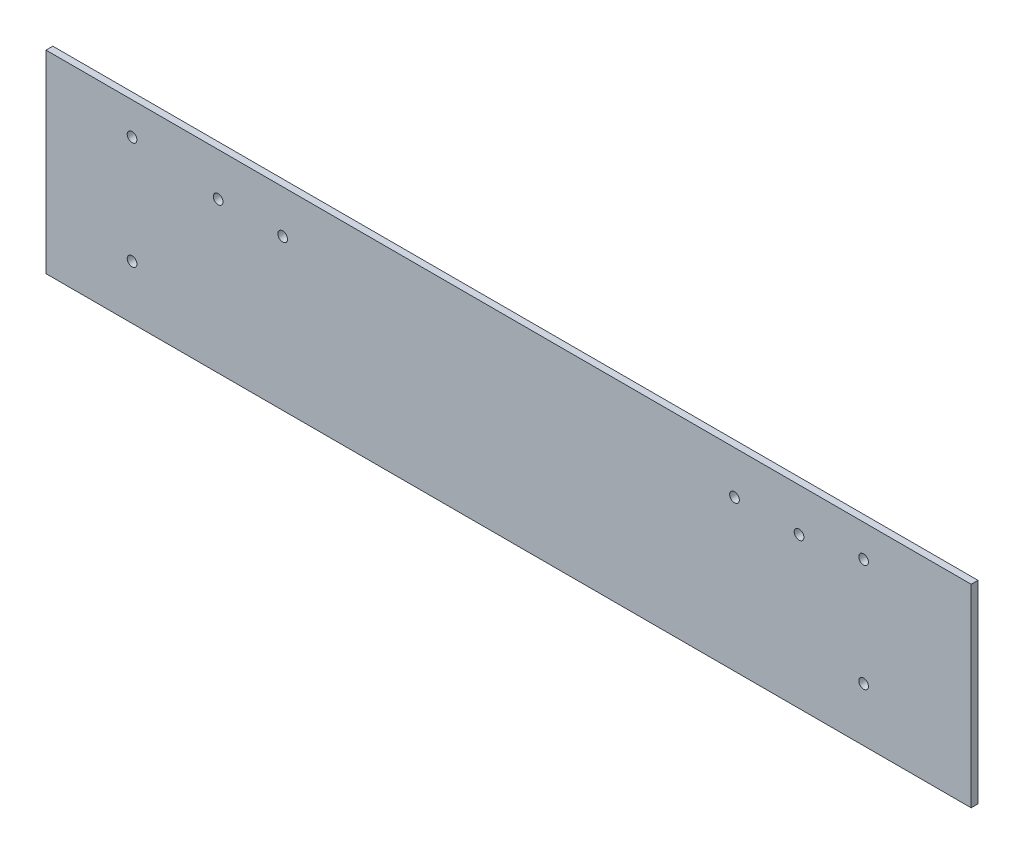
ISO-10303-21;
HEADER;
FILE_DESCRIPTION(('STEP AP214'),'2;1');
FILE_NAME('part.step','',(''),(''),'','','');
FILE_SCHEMA(('AUTOMOTIVE_DESIGN { 1 0 10303 214 1 1 1 1 }'));
ENDSEC;
DATA;
#1=APPLICATION_CONTEXT('core data for automotive mechanical design processes');
#2=APPLICATION_PROTOCOL_DEFINITION('international standard','automotive_design',2000,#1);
#3=PRODUCT_CONTEXT('',#1,'mechanical');
#4=PRODUCT('Part','Part','',(#3));
#5=PRODUCT_RELATED_PRODUCT_CATEGORY('part','',(#4));
#6=PRODUCT_DEFINITION_FORMATION('','',#4);
#7=PRODUCT_DEFINITION_CONTEXT('part definition',#1,'design');
#8=PRODUCT_DEFINITION('design','',#6,#7);
#9=PRODUCT_DEFINITION_SHAPE('','',#8);
#10=(LENGTH_UNIT() NAMED_UNIT(*) SI_UNIT(.MILLI.,.METRE.));
#11=(NAMED_UNIT(*) PLANE_ANGLE_UNIT() SI_UNIT($,.RADIAN.));
#12=(NAMED_UNIT(*) SI_UNIT($,.STERADIAN.) SOLID_ANGLE_UNIT());
#13=UNCERTAINTY_MEASURE_WITH_UNIT(LENGTH_MEASURE(1.E-05),#10,'distance_accuracy_value','');
#14=(GEOMETRIC_REPRESENTATION_CONTEXT(3) GLOBAL_UNCERTAINTY_ASSIGNED_CONTEXT((#13)) GLOBAL_UNIT_ASSIGNED_CONTEXT((#10,
#11,#12)) REPRESENTATION_CONTEXT('',''));
#15=CARTESIAN_POINT('',(0.,0.,0.));
#16=DIRECTION('',(0.,0.,1.));
#17=DIRECTION('',(1.,0.,0.));
#18=AXIS2_PLACEMENT_3D('',#15,#16,#17);
#19=CARTESIAN_POINT('',(0.,0.,0.));
#20=DIRECTION('',(0.,0.,-1.));
#21=DIRECTION('',(-1.,0.,0.));
#22=AXIS2_PLACEMENT_3D('',#19,#20,#21);
#23=PLANE('',#22);
#24=CARTESIAN_POINT('',(135.,25.,0.));
#25=DIRECTION('',(0.,0.,1.));
#26=DIRECTION('',(1.,0.,0.));
#27=AXIS2_PLACEMENT_3D('',#24,#25,#26);
#28=CIRCLE('',#27,2.25);
#29=CARTESIAN_POINT('',(137.25,25.,0.));
#30=VERTEX_POINT('',#29);
#31=EDGE_CURVE('E197',#30,#30,#28,.T.);
#32=ORIENTED_EDGE('',*,*,#31,.T.);
#33=EDGE_LOOP('',(#32));
#34=FACE_BOUND('',#33,.T.);
#35=CARTESIAN_POINT('',(105.,25.,0.));
#36=DIRECTION('',(0.,0.,1.));
#37=DIRECTION('',(1.,0.,0.));
#38=AXIS2_PLACEMENT_3D('',#35,#36,#37);
#39=CIRCLE('',#38,2.25);
#40=CARTESIAN_POINT('',(107.25,25.,0.));
#41=VERTEX_POINT('',#40);
#42=EDGE_CURVE('E189',#41,#41,#39,.T.);
#43=ORIENTED_EDGE('',*,*,#42,.T.);
#44=EDGE_LOOP('',(#43));
#45=FACE_BOUND('',#44,.T.);
#46=CARTESIAN_POINT('',(-135.,25.,0.));
#47=DIRECTION('',(0.,0.,1.));
#48=DIRECTION('',(1.,0.,0.));
#49=AXIS2_PLACEMENT_3D('',#46,#47,#48);
#50=CIRCLE('',#49,2.25);
#51=CARTESIAN_POINT('',(-132.75,25.,0.));
#52=VERTEX_POINT('',#51);
#53=EDGE_CURVE('E181',#52,#52,#50,.T.);
#54=ORIENTED_EDGE('',*,*,#53,.T.);
#55=EDGE_LOOP('',(#54));
#56=FACE_BOUND('',#55,.T.);
#57=CARTESIAN_POINT('',(-105.,25.,0.));
#58=DIRECTION('',(0.,0.,1.));
#59=DIRECTION('',(1.,0.,0.));
#60=AXIS2_PLACEMENT_3D('',#57,#58,#59);
#61=CIRCLE('',#60,2.25);
#62=CARTESIAN_POINT('',(-102.75,25.,0.));
#63=VERTEX_POINT('',#62);
#64=EDGE_CURVE('E173',#63,#63,#61,.T.);
#65=ORIENTED_EDGE('',*,*,#64,.T.);
#66=EDGE_LOOP('',(#65));
#67=FACE_BOUND('',#66,.T.);
#68=CARTESIAN_POINT('',(165.,30.,0.));
#69=DIRECTION('',(0.,0.,1.));
#70=DIRECTION('',(1.,0.,0.));
#71=AXIS2_PLACEMENT_3D('',#68,#69,#70);
#72=CIRCLE('',#71,2.25);
#73=CARTESIAN_POINT('',(167.25,30.,0.));
#74=VERTEX_POINT('',#73);
#75=EDGE_CURVE('E165',#74,#74,#72,.T.);
#76=ORIENTED_EDGE('',*,*,#75,.T.);
#77=EDGE_LOOP('',(#76));
#78=FACE_BOUND('',#77,.T.);
#79=CARTESIAN_POINT('',(-175.,-20.,0.));
#80=DIRECTION('',(0.,0.,1.));
#81=DIRECTION('',(1.,0.,0.));
#82=AXIS2_PLACEMENT_3D('',#79,#80,#81);
#83=CIRCLE('',#82,2.25);
#84=CARTESIAN_POINT('',(-172.75,-20.,0.));
#85=VERTEX_POINT('',#84);
#86=EDGE_CURVE('E157',#85,#85,#83,.T.);
#87=ORIENTED_EDGE('',*,*,#86,.T.);
#88=EDGE_LOOP('',(#87));
#89=FACE_BOUND('',#88,.T.);
#90=DIRECTION('',(0.,1.,0.));
#91=VECTOR('',#90,1.);
#92=CARTESIAN_POINT('',(215.,-45.,0.));
#93=LINE('',#92,#91);
#94=CARTESIAN_POINT('',(215.,-45.,0.));
#95=VERTEX_POINT('',#94);
#96=CARTESIAN_POINT('',(215.,45.,0.));
#97=VERTEX_POINT('',#96);
#98=EDGE_CURVE('E117',#95,#97,#93,.T.);
#99=ORIENTED_EDGE('',*,*,#98,.F.);
#100=DIRECTION('',(1.,0.,0.));
#101=VECTOR('',#100,1.);
#102=CARTESIAN_POINT('',(-215.,-45.,0.));
#103=LINE('',#102,#101);
#104=CARTESIAN_POINT('',(-215.,-45.,0.));
#105=VERTEX_POINT('',#104);
#106=EDGE_CURVE('E86',#105,#95,#103,.T.);
#107=ORIENTED_EDGE('',*,*,#106,.F.);
#108=DIRECTION('',(0.,-1.,0.));
#109=VECTOR('',#108,1.);
#110=CARTESIAN_POINT('',(-215.,-45.,0.));
#111=LINE('',#110,#109);
#112=CARTESIAN_POINT('',(-215.,45.,0.));
#113=VERTEX_POINT('',#112);
#114=EDGE_CURVE('E80',#113,#105,#111,.T.);
#115=ORIENTED_EDGE('',*,*,#114,.F.);
#116=DIRECTION('',(-1.,0.,0.));
#117=VECTOR('',#116,1.);
#118=CARTESIAN_POINT('',(-215.,45.,0.));
#119=LINE('',#118,#117);
#120=EDGE_CURVE('E104',#97,#113,#119,.T.);
#121=ORIENTED_EDGE('',*,*,#120,.F.);
#122=EDGE_LOOP('',(#99,#107,#115,#121));
#123=FACE_BOUND('',#122,.T.);
#124=CARTESIAN_POINT('',(165.,-20.,0.));
#125=DIRECTION('',(0.,0.,1.));
#126=DIRECTION('',(1.,0.,0.));
#127=AXIS2_PLACEMENT_3D('',#124,#125,#126);
#128=CIRCLE('',#127,2.25);
#129=CARTESIAN_POINT('',(167.25,-20.,0.));
#130=VERTEX_POINT('',#129);
#131=EDGE_CURVE('E121',#130,#130,#128,.T.);
#132=ORIENTED_EDGE('',*,*,#131,.T.);
#133=EDGE_LOOP('',(#132));
#134=FACE_BOUND('',#133,.T.);
#135=CARTESIAN_POINT('',(-175.,30.,0.));
#136=DIRECTION('',(0.,0.,1.));
#137=DIRECTION('',(1.,0.,0.));
#138=AXIS2_PLACEMENT_3D('',#135,#136,#137);
#139=CIRCLE('',#138,2.25);
#140=CARTESIAN_POINT('',(-172.75,30.,0.));
#141=VERTEX_POINT('',#140);
#142=EDGE_CURVE('E149',#141,#141,#139,.T.);
#143=ORIENTED_EDGE('',*,*,#142,.T.);
#144=EDGE_LOOP('',(#143));
#145=FACE_BOUND('',#144,.T.);
#146=ADVANCED_FACE('F45',(#34,#45,#56,#67,#78,#89,#123,#134,#145),#23,.T.);
#147=CARTESIAN_POINT('',(0.,0.,3.175));
#148=DIRECTION('',(0.,0.,-1.));
#149=DIRECTION('',(-1.,0.,0.));
#150=AXIS2_PLACEMENT_3D('',#147,#148,#149);
#151=PLANE('',#150);
#152=CARTESIAN_POINT('',(135.,25.,3.175));
#153=DIRECTION('',(0.,0.,1.));
#154=DIRECTION('',(1.,0.,0.));
#155=AXIS2_PLACEMENT_3D('',#152,#153,#154);
#156=CIRCLE('',#155,2.24999999999997);
#157=CARTESIAN_POINT('',(137.25,25.,3.175));
#158=VERTEX_POINT('',#157);
#159=EDGE_CURVE('E201',#158,#158,#156,.T.);
#160=ORIENTED_EDGE('',*,*,#159,.F.);
#161=EDGE_LOOP('',(#160));
#162=FACE_BOUND('',#161,.T.);
#163=CARTESIAN_POINT('',(105.,25.,3.175));
#164=DIRECTION('',(0.,0.,1.));
#165=DIRECTION('',(1.,0.,0.));
#166=AXIS2_PLACEMENT_3D('',#163,#164,#165);
#167=CIRCLE('',#166,2.24999999999999);
#168=CARTESIAN_POINT('',(107.25,25.,3.175));
#169=VERTEX_POINT('',#168);
#170=EDGE_CURVE('E193',#169,#169,#167,.T.);
#171=ORIENTED_EDGE('',*,*,#170,.F.);
#172=EDGE_LOOP('',(#171));
#173=FACE_BOUND('',#172,.T.);
#174=CARTESIAN_POINT('',(-135.,25.,3.175));
#175=DIRECTION('',(0.,0.,1.));
#176=DIRECTION('',(1.,0.,0.));
#177=AXIS2_PLACEMENT_3D('',#174,#175,#176);
#178=CIRCLE('',#177,2.24999999999997);
#179=CARTESIAN_POINT('',(-132.75,25.,3.175));
#180=VERTEX_POINT('',#179);
#181=EDGE_CURVE('E185',#180,#180,#178,.T.);
#182=ORIENTED_EDGE('',*,*,#181,.F.);
#183=EDGE_LOOP('',(#182));
#184=FACE_BOUND('',#183,.T.);
#185=CARTESIAN_POINT('',(-105.,25.,3.175));
#186=DIRECTION('',(0.,0.,1.));
#187=DIRECTION('',(1.,0.,0.));
#188=AXIS2_PLACEMENT_3D('',#185,#186,#187);
#189=CIRCLE('',#188,2.24999999999999);
#190=CARTESIAN_POINT('',(-102.75,25.,3.175));
#191=VERTEX_POINT('',#190);
#192=EDGE_CURVE('E177',#191,#191,#189,.T.);
#193=ORIENTED_EDGE('',*,*,#192,.F.);
#194=EDGE_LOOP('',(#193));
#195=FACE_BOUND('',#194,.T.);
#196=CARTESIAN_POINT('',(165.,30.,3.175));
#197=DIRECTION('',(0.,0.,1.));
#198=DIRECTION('',(1.,0.,0.));
#199=AXIS2_PLACEMENT_3D('',#196,#197,#198);
#200=CIRCLE('',#199,2.24999999999997);
#201=CARTESIAN_POINT('',(167.25,30.,3.175));
#202=VERTEX_POINT('',#201);
#203=EDGE_CURVE('E169',#202,#202,#200,.T.);
#204=ORIENTED_EDGE('',*,*,#203,.F.);
#205=EDGE_LOOP('',(#204));
#206=FACE_BOUND('',#205,.T.);
#207=CARTESIAN_POINT('',(-175.,-20.,3.175));
#208=DIRECTION('',(0.,0.,1.));
#209=DIRECTION('',(1.,0.,0.));
#210=AXIS2_PLACEMENT_3D('',#207,#208,#209);
#211=CIRCLE('',#210,2.24999999999997);
#212=CARTESIAN_POINT('',(-172.75,-20.,3.175));
#213=VERTEX_POINT('',#212);
#214=EDGE_CURVE('E161',#213,#213,#211,.T.);
#215=ORIENTED_EDGE('',*,*,#214,.F.);
#216=EDGE_LOOP('',(#215));
#217=FACE_BOUND('',#216,.T.);
#218=CARTESIAN_POINT('',(165.,-20.,3.175));
#219=DIRECTION('',(0.,0.,1.));
#220=DIRECTION('',(1.,0.,0.));
#221=AXIS2_PLACEMENT_3D('',#218,#219,#220);
#222=CIRCLE('',#221,2.24999999999997);
#223=CARTESIAN_POINT('',(167.25,-20.,3.175));
#224=VERTEX_POINT('',#223);
#225=EDGE_CURVE('E145',#224,#224,#222,.T.);
#226=ORIENTED_EDGE('',*,*,#225,.F.);
#227=EDGE_LOOP('',(#226));
#228=FACE_BOUND('',#227,.T.);
#229=DIRECTION('',(0.,1.,0.));
#230=VECTOR('',#229,1.);
#231=CARTESIAN_POINT('',(215.,-45.,3.175));
#232=LINE('',#231,#230);
#233=CARTESIAN_POINT('',(215.,-45.,3.175));
#234=VERTEX_POINT('',#233);
#235=CARTESIAN_POINT('',(215.,45.,3.175));
#236=VERTEX_POINT('',#235);
#237=EDGE_CURVE('E99',#234,#236,#232,.T.);
#238=ORIENTED_EDGE('',*,*,#237,.T.);
#239=DIRECTION('',(-1.,0.,0.));
#240=VECTOR('',#239,1.);
#241=CARTESIAN_POINT('',(-215.,45.,3.175));
#242=LINE('',#241,#240);
#243=CARTESIAN_POINT('',(-215.,45.,3.175));
#244=VERTEX_POINT('',#243);
#245=EDGE_CURVE('E93',#236,#244,#242,.T.);
#246=ORIENTED_EDGE('',*,*,#245,.T.);
#247=DIRECTION('',(0.,-1.,0.));
#248=VECTOR('',#247,1.);
#249=CARTESIAN_POINT('',(-215.,-45.,3.175));
#250=LINE('',#249,#248);
#251=CARTESIAN_POINT('',(-215.,-45.,3.175));
#252=VERTEX_POINT('',#251);
#253=EDGE_CURVE('E97',#244,#252,#250,.T.);
#254=ORIENTED_EDGE('',*,*,#253,.T.);
#255=DIRECTION('',(1.,0.,0.));
#256=VECTOR('',#255,1.);
#257=CARTESIAN_POINT('',(-215.,-45.,3.175));
#258=LINE('',#257,#256);
#259=EDGE_CURVE('E63',#252,#234,#258,.T.);
#260=ORIENTED_EDGE('',*,*,#259,.T.);
#261=EDGE_LOOP('',(#238,#246,#254,#260));
#262=FACE_BOUND('',#261,.T.);
#263=CARTESIAN_POINT('',(-175.,30.,3.175));
#264=DIRECTION('',(0.,0.,1.));
#265=DIRECTION('',(1.,0.,0.));
#266=AXIS2_PLACEMENT_3D('',#263,#264,#265);
#267=CIRCLE('',#266,2.24999999999997);
#268=CARTESIAN_POINT('',(-172.75,30.,3.175));
#269=VERTEX_POINT('',#268);
#270=EDGE_CURVE('E153',#269,#269,#267,.T.);
#271=ORIENTED_EDGE('',*,*,#270,.F.);
#272=EDGE_LOOP('',(#271));
#273=FACE_BOUND('',#272,.T.);
#274=ADVANCED_FACE('F94',(#162,#173,#184,#195,#206,#217,#228,#262,#273),#151,.F.);
#275=CARTESIAN_POINT('',(215.,-45.,3.175));
#276=DIRECTION('',(-1.,0.,0.));
#277=DIRECTION('',(0.,0.,1.));
#278=AXIS2_PLACEMENT_3D('',#275,#276,#277);
#279=PLANE('',#278);
#280=ORIENTED_EDGE('',*,*,#98,.T.);
#281=DIRECTION('',(0.,0.,-1.));
#282=VECTOR('',#281,1.);
#283=CARTESIAN_POINT('',(215.,45.,3.175));
#284=LINE('',#283,#282);
#285=EDGE_CURVE('E11',#236,#97,#284,.T.);
#286=ORIENTED_EDGE('',*,*,#285,.F.);
#287=ORIENTED_EDGE('',*,*,#237,.F.);
#288=DIRECTION('',(0.,0.,-1.));
#289=VECTOR('',#288,1.);
#290=CARTESIAN_POINT('',(215.,-45.,3.175));
#291=LINE('',#290,#289);
#292=EDGE_CURVE('E113',#234,#95,#291,.T.);
#293=ORIENTED_EDGE('',*,*,#292,.T.);
#294=EDGE_LOOP('',(#280,#286,#287,#293));
#295=FACE_BOUND('',#294,.T.);
#296=ADVANCED_FACE('F47',(#295),#279,.F.);
#297=CARTESIAN_POINT('',(-215.,45.,3.175));
#298=DIRECTION('',(0.,-1.,0.));
#299=DIRECTION('',(0.,0.,-1.));
#300=AXIS2_PLACEMENT_3D('',#297,#298,#299);
#301=PLANE('',#300);
#302=ORIENTED_EDGE('',*,*,#120,.T.);
#303=DIRECTION('',(0.,0.,-1.));
#304=VECTOR('',#303,1.);
#305=CARTESIAN_POINT('',(-215.,45.,3.175));
#306=LINE('',#305,#304);
#307=EDGE_CURVE('E55',#244,#113,#306,.T.);
#308=ORIENTED_EDGE('',*,*,#307,.F.);
#309=ORIENTED_EDGE('',*,*,#245,.F.);
#310=ORIENTED_EDGE('',*,*,#285,.T.);
#311=EDGE_LOOP('',(#302,#308,#309,#310));
#312=FACE_BOUND('',#311,.T.);
#313=ADVANCED_FACE('F103',(#312),#301,.F.);
#314=CARTESIAN_POINT('',(-215.,-45.,3.175));
#315=DIRECTION('',(1.,0.,0.));
#316=DIRECTION('',(0.,0.,-1.));
#317=AXIS2_PLACEMENT_3D('',#314,#315,#316);
#318=PLANE('',#317);
#319=ORIENTED_EDGE('',*,*,#114,.T.);
#320=DIRECTION('',(0.,0.,-1.));
#321=VECTOR('',#320,1.);
#322=CARTESIAN_POINT('',(-215.,-45.,3.175));
#323=LINE('',#322,#321);
#324=EDGE_CURVE('E106',#252,#105,#323,.T.);
#325=ORIENTED_EDGE('',*,*,#324,.F.);
#326=ORIENTED_EDGE('',*,*,#253,.F.);
#327=ORIENTED_EDGE('',*,*,#307,.T.);
#328=EDGE_LOOP('',(#319,#325,#326,#327));
#329=FACE_BOUND('',#328,.T.);
#330=ADVANCED_FACE('F107',(#329),#318,.F.);
#331=CARTESIAN_POINT('',(-215.,-45.,3.175));
#332=DIRECTION('',(0.,1.,0.));
#333=DIRECTION('',(0.,0.,1.));
#334=AXIS2_PLACEMENT_3D('',#331,#332,#333);
#335=PLANE('',#334);
#336=ORIENTED_EDGE('',*,*,#106,.T.);
#337=ORIENTED_EDGE('',*,*,#292,.F.);
#338=ORIENTED_EDGE('',*,*,#259,.F.);
#339=ORIENTED_EDGE('',*,*,#324,.T.);
#340=EDGE_LOOP('',(#336,#337,#338,#339));
#341=FACE_BOUND('',#340,.T.);
#342=ADVANCED_FACE('F133',(#341),#335,.F.);
#343=CARTESIAN_POINT('',(165.,-20.,3.175));
#344=DIRECTION('',(0.,0.,1.));
#345=DIRECTION('',(1.,0.,0.));
#346=AXIS2_PLACEMENT_3D('',#343,#344,#345);
#347=CYLINDRICAL_SURFACE('',#346,2.24999999999999);
#348=ORIENTED_EDGE('',*,*,#131,.F.);
#349=EDGE_LOOP('',(#348));
#350=FACE_BOUND('',#349,.T.);
#351=ORIENTED_EDGE('',*,*,#225,.T.);
#352=EDGE_LOOP('',(#351));
#353=FACE_BOUND('',#352,.T.);
#354=ADVANCED_FACE('F225',(#350,#353),#347,.F.);
#355=CARTESIAN_POINT('',(-175.,30.,3.175));
#356=DIRECTION('',(0.,0.,1.));
#357=DIRECTION('',(1.,0.,0.));
#358=AXIS2_PLACEMENT_3D('',#355,#356,#357);
#359=CYLINDRICAL_SURFACE('',#358,2.24999999999999);
#360=ORIENTED_EDGE('',*,*,#142,.F.);
#361=EDGE_LOOP('',(#360));
#362=FACE_BOUND('',#361,.T.);
#363=ORIENTED_EDGE('',*,*,#270,.T.);
#364=EDGE_LOOP('',(#363));
#365=FACE_BOUND('',#364,.T.);
#366=ADVANCED_FACE('F227',(#362,#365),#359,.F.);
#367=CARTESIAN_POINT('',(-175.,-20.,3.175));
#368=DIRECTION('',(0.,0.,1.));
#369=DIRECTION('',(1.,0.,0.));
#370=AXIS2_PLACEMENT_3D('',#367,#368,#369);
#371=CYLINDRICAL_SURFACE('',#370,2.24999999999999);
#372=ORIENTED_EDGE('',*,*,#86,.F.);
#373=EDGE_LOOP('',(#372));
#374=FACE_BOUND('',#373,.T.);
#375=ORIENTED_EDGE('',*,*,#214,.T.);
#376=EDGE_LOOP('',(#375));
#377=FACE_BOUND('',#376,.T.);
#378=ADVANCED_FACE('F234',(#374,#377),#371,.F.);
#379=CARTESIAN_POINT('',(165.,30.,3.175));
#380=DIRECTION('',(0.,0.,1.));
#381=DIRECTION('',(1.,0.,0.));
#382=AXIS2_PLACEMENT_3D('',#379,#380,#381);
#383=CYLINDRICAL_SURFACE('',#382,2.24999999999999);
#384=ORIENTED_EDGE('',*,*,#75,.F.);
#385=EDGE_LOOP('',(#384));
#386=FACE_BOUND('',#385,.T.);
#387=ORIENTED_EDGE('',*,*,#203,.T.);
#388=EDGE_LOOP('',(#387));
#389=FACE_BOUND('',#388,.T.);
#390=ADVANCED_FACE('F290',(#386,#389),#383,.F.);
#391=CARTESIAN_POINT('',(-105.,25.,3.175));
#392=DIRECTION('',(0.,0.,1.));
#393=DIRECTION('',(1.,0.,0.));
#394=AXIS2_PLACEMENT_3D('',#391,#392,#393);
#395=CYLINDRICAL_SURFACE('',#394,2.25);
#396=ORIENTED_EDGE('',*,*,#64,.F.);
#397=EDGE_LOOP('',(#396));
#398=FACE_BOUND('',#397,.T.);
#399=ORIENTED_EDGE('',*,*,#192,.T.);
#400=EDGE_LOOP('',(#399));
#401=FACE_BOUND('',#400,.T.);
#402=ADVANCED_FACE('F277',(#398,#401),#395,.F.);
#403=CARTESIAN_POINT('',(-135.,25.,3.175));
#404=DIRECTION('',(0.,0.,1.));
#405=DIRECTION('',(1.,0.,0.));
#406=AXIS2_PLACEMENT_3D('',#403,#404,#405);
#407=CYLINDRICAL_SURFACE('',#406,2.24999999999999);
#408=ORIENTED_EDGE('',*,*,#53,.F.);
#409=EDGE_LOOP('',(#408));
#410=FACE_BOUND('',#409,.T.);
#411=ORIENTED_EDGE('',*,*,#181,.T.);
#412=EDGE_LOOP('',(#411));
#413=FACE_BOUND('',#412,.T.);
#414=ADVANCED_FACE('F270',(#410,#413),#407,.F.);
#415=CARTESIAN_POINT('',(105.,25.,3.175));
#416=DIRECTION('',(0.,0.,1.));
#417=DIRECTION('',(1.,0.,0.));
#418=AXIS2_PLACEMENT_3D('',#415,#416,#417);
#419=CYLINDRICAL_SURFACE('',#418,2.25);
#420=ORIENTED_EDGE('',*,*,#42,.F.);
#421=EDGE_LOOP('',(#420));
#422=FACE_BOUND('',#421,.T.);
#423=ORIENTED_EDGE('',*,*,#170,.T.);
#424=EDGE_LOOP('',(#423));
#425=FACE_BOUND('',#424,.T.);
#426=ADVANCED_FACE('F276',(#422,#425),#419,.F.);
#427=CARTESIAN_POINT('',(135.,25.,3.175));
#428=DIRECTION('',(0.,0.,1.));
#429=DIRECTION('',(1.,0.,0.));
#430=AXIS2_PLACEMENT_3D('',#427,#428,#429);
#431=CYLINDRICAL_SURFACE('',#430,2.24999999999999);
#432=ORIENTED_EDGE('',*,*,#31,.F.);
#433=EDGE_LOOP('',(#432));
#434=FACE_BOUND('',#433,.T.);
#435=ORIENTED_EDGE('',*,*,#159,.T.);
#436=EDGE_LOOP('',(#435));
#437=FACE_BOUND('',#436,.T.);
#438=ADVANCED_FACE('F208',(#434,#437),#431,.F.);
#439=CLOSED_SHELL('',(#146,#274,#296,#313,#330,#342,#354,#366,#378,#390,#402,#414,#426,#438));
#440=MANIFOLD_SOLID_BREP('B2',#439);
#441=ADVANCED_BREP_SHAPE_REPRESENTATION('',(#18,#440),#14);
#442=SHAPE_DEFINITION_REPRESENTATION(#9,#441);
ENDSEC;
END-ISO-10303-21;
